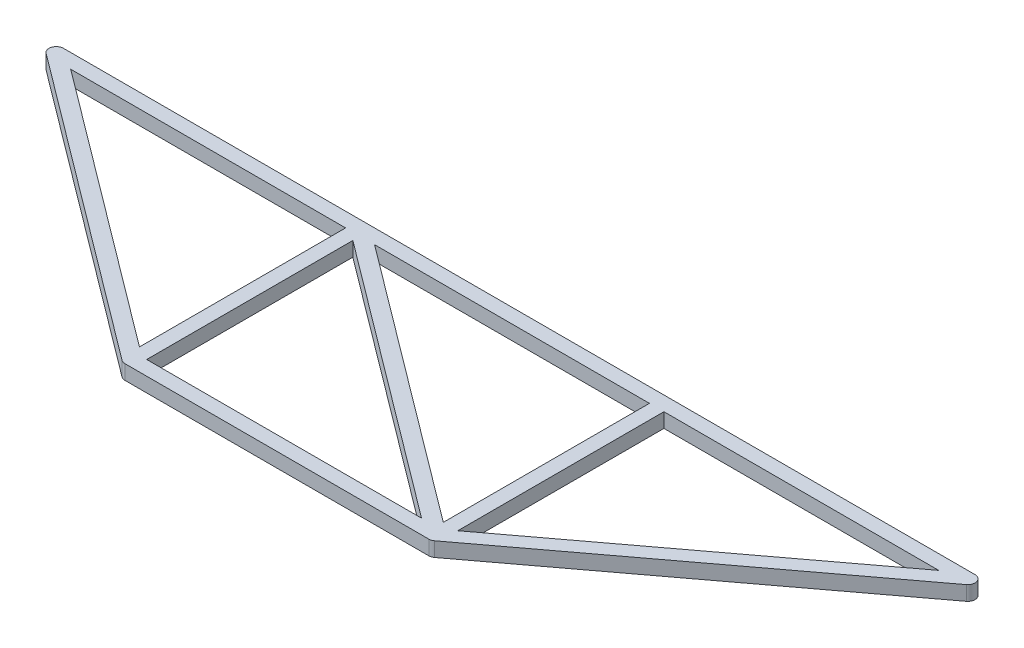
ISO-10303-21;
HEADER;
FILE_DESCRIPTION(('STEP AP214'),'2;1');
FILE_NAME('part.step','',(''),(''),'','','');
FILE_SCHEMA(('AUTOMOTIVE_DESIGN { 1 0 10303 214 1 1 1 1 }'));
ENDSEC;
DATA;
#1=APPLICATION_CONTEXT('core data for automotive mechanical design processes');
#2=APPLICATION_PROTOCOL_DEFINITION('international standard','automotive_design',2000,#1);
#3=PRODUCT_CONTEXT('',#1,'mechanical');
#4=PRODUCT('Part','Part','',(#3));
#5=PRODUCT_RELATED_PRODUCT_CATEGORY('part','',(#4));
#6=PRODUCT_DEFINITION_FORMATION('','',#4);
#7=PRODUCT_DEFINITION_CONTEXT('part definition',#1,'design');
#8=PRODUCT_DEFINITION('design','',#6,#7);
#9=PRODUCT_DEFINITION_SHAPE('','',#8);
#10=(LENGTH_UNIT() NAMED_UNIT(*) SI_UNIT(.MILLI.,.METRE.));
#11=(NAMED_UNIT(*) PLANE_ANGLE_UNIT() SI_UNIT($,.RADIAN.));
#12=(NAMED_UNIT(*) SI_UNIT($,.STERADIAN.) SOLID_ANGLE_UNIT());
#13=UNCERTAINTY_MEASURE_WITH_UNIT(LENGTH_MEASURE(1.E-05),#10,'distance_accuracy_value','');
#14=(GEOMETRIC_REPRESENTATION_CONTEXT(3) GLOBAL_UNCERTAINTY_ASSIGNED_CONTEXT((#13)) GLOBAL_UNIT_ASSIGNED_CONTEXT((#10,
#11,#12)) REPRESENTATION_CONTEXT('',''));
#15=CARTESIAN_POINT('',(0.,0.,0.));
#16=DIRECTION('',(0.,0.,1.));
#17=DIRECTION('',(1.,0.,0.));
#18=AXIS2_PLACEMENT_3D('',#15,#16,#17);
#19=CARTESIAN_POINT('',(0.,19.08,0.));
#20=DIRECTION('',(0.,-1.,0.));
#21=DIRECTION('',(0.,0.,-1.));
#22=AXIS2_PLACEMENT_3D('',#19,#20,#21);
#23=PLANE('',#22);
#24=DIRECTION('',(0.,0.,-1.));
#25=VECTOR('',#24,1.);
#26=CARTESIAN_POINT('',(790.46,19.08,9.54));
#27=LINE('',#26,#25);
#28=CARTESIAN_POINT('',(790.46,19.08,280.92185104477));
#29=VERTEX_POINT('',#28);
#30=CARTESIAN_POINT('',(790.46,19.08,9.54));
#31=VERTEX_POINT('',#30);
#32=EDGE_CURVE('E207',#29,#31,#27,.T.);
#33=ORIENTED_EDGE('',*,*,#32,.F.);
#34=DIRECTION('',(0.8,0.,0.6));
#35=VECTOR('',#34,1.);
#36=CARTESIAN_POINT('',(790.46,19.08,280.92185104477));
#37=LINE('',#36,#35);
#38=CARTESIAN_POINT('',(428.617531940306,19.08,9.53999999999999));
#39=VERTEX_POINT('',#38);
#40=EDGE_CURVE('E213',#39,#29,#37,.T.);
#41=ORIENTED_EDGE('',*,*,#40,.F.);
#42=DIRECTION('',(-1.,0.,0.));
#43=VECTOR('',#42,1.);
#44=CARTESIAN_POINT('',(428.617531940306,19.08,9.54));
#45=LINE('',#44,#43);
#46=EDGE_CURVE('E209',#31,#39,#45,.T.);
#47=ORIENTED_EDGE('',*,*,#46,.F.);
#48=EDGE_LOOP('',(#33,#41,#47));
#49=FACE_BOUND('',#48,.T.);
#50=DIRECTION('',(0.8,0.,0.6));
#51=VECTOR('',#50,1.);
#52=CARTESIAN_POINT('',(28.62,19.08,9.54));
#53=LINE('',#52,#51);
#54=CARTESIAN_POINT('',(28.62,19.08,9.54));
#55=VERTEX_POINT('',#54);
#56=CARTESIAN_POINT('',(390.46,19.08,280.92));
#57=VERTEX_POINT('',#56);
#58=EDGE_CURVE('E255',#55,#57,#53,.T.);
#59=ORIENTED_EDGE('',*,*,#58,.F.);
#60=DIRECTION('',(-1.,0.,0.));
#61=VECTOR('',#60,1.);
#62=CARTESIAN_POINT('',(390.46,19.08,9.54));
#63=LINE('',#62,#61);
#64=CARTESIAN_POINT('',(390.46,19.08,9.54));
#65=VERTEX_POINT('',#64);
#66=EDGE_CURVE('E261',#65,#55,#63,.T.);
#67=ORIENTED_EDGE('',*,*,#66,.F.);
#68=DIRECTION('',(0.,0.,-1.));
#69=VECTOR('',#68,1.);
#70=CARTESIAN_POINT('',(390.46,19.08,280.92));
#71=LINE('',#70,#69);
#72=EDGE_CURVE('E257',#57,#65,#71,.T.);
#73=ORIENTED_EDGE('',*,*,#72,.F.);
#74=EDGE_LOOP('',(#59,#67,#73));
#75=FACE_BOUND('',#74,.T.);
#76=CARTESIAN_POINT('',(0.,19.08,0.));
#77=DIRECTION('',(0.,1.,0.));
#78=DIRECTION('',(0.,0.,-1.));
#79=AXIS2_PLACEMENT_3D('',#76,#77,#78);
#80=CIRCLE('',#79,9.54000000000006);
#81=CARTESIAN_POINT('',(0.,19.08,-9.54));
#82=VERTEX_POINT('',#81);
#83=CARTESIAN_POINT('',(-5.72400000000007,19.08,7.6320000000001));
#84=VERTEX_POINT('',#83);
#85=EDGE_CURVE('E279',#82,#84,#80,.T.);
#86=ORIENTED_EDGE('',*,*,#85,.T.);
#87=DIRECTION('',(0.8,0.,0.6));
#88=VECTOR('',#87,1.);
#89=CARTESIAN_POINT('',(394.276,19.08,307.632));
#90=LINE('',#89,#88);
#91=CARTESIAN_POINT('',(394.276,19.08,307.632));
#92=VERTEX_POINT('',#91);
#93=EDGE_CURVE('E282',#84,#92,#90,.T.);
#94=ORIENTED_EDGE('',*,*,#93,.T.);
#95=CARTESIAN_POINT('',(400.,19.08,299.999999999999));
#96=DIRECTION('',(0.,1.,0.));
#97=DIRECTION('',(0.,0.,1.));
#98=AXIS2_PLACEMENT_3D('',#95,#96,#97);
#99=CIRCLE('',#98,9.54000000000055);
#100=CARTESIAN_POINT('',(400.,19.08,309.54));
#101=VERTEX_POINT('',#100);
#102=EDGE_CURVE('E285',#92,#101,#99,.T.);
#103=ORIENTED_EDGE('',*,*,#102,.T.);
#104=DIRECTION('',(1.,0.,0.));
#105=VECTOR('',#104,1.);
#106=CARTESIAN_POINT('',(800.,19.08,309.54));
#107=LINE('',#106,#105);
#108=CARTESIAN_POINT('',(800.,19.08,309.54));
#109=VERTEX_POINT('',#108);
#110=EDGE_CURVE('E287',#101,#109,#107,.T.);
#111=ORIENTED_EDGE('',*,*,#110,.T.);
#112=CARTESIAN_POINT('',(800.000000000001,19.08,300.000000000001));
#113=DIRECTION('',(0.,1.,0.));
#114=DIRECTION('',(0.,0.,1.));
#115=AXIS2_PLACEMENT_3D('',#112,#113,#114);
#116=CIRCLE('',#115,9.53999999999905);
#117=CARTESIAN_POINT('',(805.724,19.08,307.632));
#118=VERTEX_POINT('',#117);
#119=EDGE_CURVE('E289',#109,#118,#116,.T.);
#120=ORIENTED_EDGE('',*,*,#119,.T.);
#121=DIRECTION('',(0.8,0.,-0.6));
#122=VECTOR('',#121,1.);
#123=CARTESIAN_POINT('',(1205.724,19.08,7.632));
#124=LINE('',#123,#122);
#125=CARTESIAN_POINT('',(1205.724,19.08,7.63199999999998));
#126=VERTEX_POINT('',#125);
#127=EDGE_CURVE('E291',#118,#126,#124,.T.);
#128=ORIENTED_EDGE('',*,*,#127,.T.);
#129=CARTESIAN_POINT('',(1200.,19.08,0.));
#130=DIRECTION('',(0.,1.,0.));
#131=DIRECTION('',(0.,0.,1.));
#132=AXIS2_PLACEMENT_3D('',#129,#130,#131);
#133=CIRCLE('',#132,9.54000000000002);
#134=CARTESIAN_POINT('',(1200.,19.08,-9.54));
#135=VERTEX_POINT('',#134);
#136=EDGE_CURVE('E293',#126,#135,#133,.T.);
#137=ORIENTED_EDGE('',*,*,#136,.T.);
#138=DIRECTION('',(-1.,0.,0.));
#139=VECTOR('',#138,1.);
#140=CARTESIAN_POINT('',(0.,19.08,-9.54));
#141=LINE('',#140,#139);
#142=EDGE_CURVE('E295',#135,#82,#141,.T.);
#143=ORIENTED_EDGE('',*,*,#142,.T.);
#144=EDGE_LOOP('',(#86,#94,#103,#111,#120,#128,#137,#143));
#145=FACE_BOUND('',#144,.T.);
#146=DIRECTION('',(-0.8,0.,-0.6));
#147=VECTOR('',#146,1.);
#148=CARTESIAN_POINT('',(771.38,19.08,290.46));
#149=LINE('',#148,#147);
#150=CARTESIAN_POINT('',(771.38,19.08,290.46));
#151=VERTEX_POINT('',#150);
#152=CARTESIAN_POINT('',(409.54,19.08,19.0800000000001));
#153=VERTEX_POINT('',#152);
#154=EDGE_CURVE('E231',#151,#153,#149,.T.);
#155=ORIENTED_EDGE('',*,*,#154,.F.);
#156=DIRECTION('',(1.,0.,0.));
#157=VECTOR('',#156,1.);
#158=CARTESIAN_POINT('',(409.54,19.08,290.46));
#159=LINE('',#158,#157);
#160=CARTESIAN_POINT('',(409.54,19.08,290.46));
#161=VERTEX_POINT('',#160);
#162=EDGE_CURVE('E237',#161,#151,#159,.T.);
#163=ORIENTED_EDGE('',*,*,#162,.F.);
#164=DIRECTION('',(0.,0.,1.));
#165=VECTOR('',#164,1.);
#166=CARTESIAN_POINT('',(409.54,19.08,19.0800000000001));
#167=LINE('',#166,#165);
#168=EDGE_CURVE('E233',#153,#161,#167,.T.);
#169=ORIENTED_EDGE('',*,*,#168,.F.);
#170=EDGE_LOOP('',(#155,#163,#169));
#171=FACE_BOUND('',#170,.T.);
#172=DIRECTION('',(0.,0.,1.));
#173=VECTOR('',#172,1.);
#174=CARTESIAN_POINT('',(809.54,19.08,9.54));
#175=LINE('',#174,#173);
#176=CARTESIAN_POINT('',(809.54,19.08,9.54));
#177=VERTEX_POINT('',#176);
#178=CARTESIAN_POINT('',(809.54,19.08,280.92));
#179=VERTEX_POINT('',#178);
#180=EDGE_CURVE('E180',#177,#179,#175,.T.);
#181=ORIENTED_EDGE('',*,*,#180,.F.);
#182=DIRECTION('',(-1.,0.,0.));
#183=VECTOR('',#182,1.);
#184=CARTESIAN_POINT('',(1171.38,19.08,9.54));
#185=LINE('',#184,#183);
#186=CARTESIAN_POINT('',(1171.38,19.08,9.54));
#187=VERTEX_POINT('',#186);
#188=EDGE_CURVE('E197',#187,#177,#185,.T.);
#189=ORIENTED_EDGE('',*,*,#188,.F.);
#190=DIRECTION('',(0.8,0.,-0.6));
#191=VECTOR('',#190,1.);
#192=CARTESIAN_POINT('',(809.54,19.08,280.92));
#193=LINE('',#192,#191);
#194=EDGE_CURVE('E188',#179,#187,#193,.T.);
#195=ORIENTED_EDGE('',*,*,#194,.F.);
#196=EDGE_LOOP('',(#181,#189,#195));
#197=FACE_BOUND('',#196,.T.);
#198=ADVANCED_FACE('F43',(#49,#75,#145,#171,#197),#23,.F.);
#199=CARTESIAN_POINT('',(0.,0.,0.));
#200=DIRECTION('',(0.,-1.,0.));
#201=DIRECTION('',(0.,0.,-1.));
#202=AXIS2_PLACEMENT_3D('',#199,#200,#201);
#203=PLANE('',#202);
#204=CARTESIAN_POINT('',(0.,0.,0.));
#205=DIRECTION('',(0.,1.,0.));
#206=DIRECTION('',(0.,0.,-1.));
#207=AXIS2_PLACEMENT_3D('',#204,#205,#206);
#208=CIRCLE('',#207,9.54000000000006);
#209=CARTESIAN_POINT('',(0.,0.,-9.54));
#210=VERTEX_POINT('',#209);
#211=CARTESIAN_POINT('',(-5.72400000000007,0.,7.6320000000001));
#212=VERTEX_POINT('',#211);
#213=EDGE_CURVE('E278',#210,#212,#208,.T.);
#214=ORIENTED_EDGE('',*,*,#213,.F.);
#215=DIRECTION('',(-1.,0.,0.));
#216=VECTOR('',#215,1.);
#217=CARTESIAN_POINT('',(0.,0.,-9.54));
#218=LINE('',#217,#216);
#219=CARTESIAN_POINT('',(1200.,0.,-9.54));
#220=VERTEX_POINT('',#219);
#221=EDGE_CURVE('E283',#220,#210,#218,.T.);
#222=ORIENTED_EDGE('',*,*,#221,.F.);
#223=CARTESIAN_POINT('',(1200.,0.,0.));
#224=DIRECTION('',(0.,1.,0.));
#225=DIRECTION('',(0.,0.,1.));
#226=AXIS2_PLACEMENT_3D('',#223,#224,#225);
#227=CIRCLE('',#226,9.54000000000002);
#228=CARTESIAN_POINT('',(1205.724,0.,7.63199999999998));
#229=VERTEX_POINT('',#228);
#230=EDGE_CURVE('E310',#229,#220,#227,.T.);
#231=ORIENTED_EDGE('',*,*,#230,.F.);
#232=DIRECTION('',(0.8,0.,-0.6));
#233=VECTOR('',#232,1.);
#234=CARTESIAN_POINT('',(1205.724,0.,7.632));
#235=LINE('',#234,#233);
#236=CARTESIAN_POINT('',(805.724,0.,307.632));
#237=VERTEX_POINT('',#236);
#238=EDGE_CURVE('E308',#237,#229,#235,.T.);
#239=ORIENTED_EDGE('',*,*,#238,.F.);
#240=CARTESIAN_POINT('',(800.000000000001,0.,300.000000000001));
#241=DIRECTION('',(0.,1.,0.));
#242=DIRECTION('',(0.,0.,1.));
#243=AXIS2_PLACEMENT_3D('',#240,#241,#242);
#244=CIRCLE('',#243,9.53999999999905);
#245=CARTESIAN_POINT('',(800.,0.,309.54));
#246=VERTEX_POINT('',#245);
#247=EDGE_CURVE('E306',#246,#237,#244,.T.);
#248=ORIENTED_EDGE('',*,*,#247,.F.);
#249=DIRECTION('',(1.,0.,0.));
#250=VECTOR('',#249,1.);
#251=CARTESIAN_POINT('',(800.,0.,309.54));
#252=LINE('',#251,#250);
#253=CARTESIAN_POINT('',(400.,0.,309.54));
#254=VERTEX_POINT('',#253);
#255=EDGE_CURVE('E304',#254,#246,#252,.T.);
#256=ORIENTED_EDGE('',*,*,#255,.F.);
#257=CARTESIAN_POINT('',(400.,0.,299.999999999999));
#258=DIRECTION('',(0.,1.,0.));
#259=DIRECTION('',(0.,0.,1.));
#260=AXIS2_PLACEMENT_3D('',#257,#258,#259);
#261=CIRCLE('',#260,9.54000000000055);
#262=CARTESIAN_POINT('',(394.276,0.,307.632));
#263=VERTEX_POINT('',#262);
#264=EDGE_CURVE('E302',#263,#254,#261,.T.);
#265=ORIENTED_EDGE('',*,*,#264,.F.);
#266=DIRECTION('',(0.8,0.,0.6));
#267=VECTOR('',#266,1.);
#268=CARTESIAN_POINT('',(394.276,0.,307.632));
#269=LINE('',#268,#267);
#270=EDGE_CURVE('E300',#212,#263,#269,.T.);
#271=ORIENTED_EDGE('',*,*,#270,.F.);
#272=EDGE_LOOP('',(#214,#222,#231,#239,#248,#256,#265,#271));
#273=FACE_BOUND('',#272,.T.);
#274=DIRECTION('',(-1.,0.,0.));
#275=VECTOR('',#274,1.);
#276=CARTESIAN_POINT('',(390.46,0.,9.54));
#277=LINE('',#276,#275);
#278=CARTESIAN_POINT('',(390.46,0.,9.54));
#279=VERTEX_POINT('',#278);
#280=CARTESIAN_POINT('',(28.62,0.,9.54));
#281=VERTEX_POINT('',#280);
#282=EDGE_CURVE('E258',#279,#281,#277,.T.);
#283=ORIENTED_EDGE('',*,*,#282,.T.);
#284=DIRECTION('',(0.8,0.,0.6));
#285=VECTOR('',#284,1.);
#286=CARTESIAN_POINT('',(28.62,0.,9.54));
#287=LINE('',#286,#285);
#288=CARTESIAN_POINT('',(390.46,0.,280.92));
#289=VERTEX_POINT('',#288);
#290=EDGE_CURVE('E254',#281,#289,#287,.T.);
#291=ORIENTED_EDGE('',*,*,#290,.T.);
#292=DIRECTION('',(0.,0.,-1.));
#293=VECTOR('',#292,1.);
#294=CARTESIAN_POINT('',(390.46,0.,280.92));
#295=LINE('',#294,#293);
#296=EDGE_CURVE('E266',#289,#279,#295,.T.);
#297=ORIENTED_EDGE('',*,*,#296,.T.);
#298=EDGE_LOOP('',(#283,#291,#297));
#299=FACE_BOUND('',#298,.T.);
#300=DIRECTION('',(1.,0.,0.));
#301=VECTOR('',#300,1.);
#302=CARTESIAN_POINT('',(409.54,0.,290.46));
#303=LINE('',#302,#301);
#304=CARTESIAN_POINT('',(409.54,0.,290.46));
#305=VERTEX_POINT('',#304);
#306=CARTESIAN_POINT('',(771.38,0.,290.46));
#307=VERTEX_POINT('',#306);
#308=EDGE_CURVE('E234',#305,#307,#303,.T.);
#309=ORIENTED_EDGE('',*,*,#308,.T.);
#310=DIRECTION('',(-0.8,0.,-0.6));
#311=VECTOR('',#310,1.);
#312=CARTESIAN_POINT('',(771.38,0.,290.46));
#313=LINE('',#312,#311);
#314=CARTESIAN_POINT('',(409.54,0.,19.0800000000001));
#315=VERTEX_POINT('',#314);
#316=EDGE_CURVE('E230',#307,#315,#313,.T.);
#317=ORIENTED_EDGE('',*,*,#316,.T.);
#318=DIRECTION('',(0.,0.,1.));
#319=VECTOR('',#318,1.);
#320=CARTESIAN_POINT('',(409.54,0.,19.0800000000001));
#321=LINE('',#320,#319);
#322=EDGE_CURVE('E242',#315,#305,#321,.T.);
#323=ORIENTED_EDGE('',*,*,#322,.T.);
#324=EDGE_LOOP('',(#309,#317,#323));
#325=FACE_BOUND('',#324,.T.);
#326=DIRECTION('',(0.8,0.,0.6));
#327=VECTOR('',#326,1.);
#328=CARTESIAN_POINT('',(790.46,0.,280.92185104477));
#329=LINE('',#328,#327);
#330=CARTESIAN_POINT('',(428.617531940306,0.,9.54));
#331=VERTEX_POINT('',#330);
#332=CARTESIAN_POINT('',(790.46,0.,280.92185104477));
#333=VERTEX_POINT('',#332);
#334=EDGE_CURVE('E210',#331,#333,#329,.T.);
#335=ORIENTED_EDGE('',*,*,#334,.T.);
#336=DIRECTION('',(0.,0.,-1.));
#337=VECTOR('',#336,1.);
#338=CARTESIAN_POINT('',(790.46,0.,9.54));
#339=LINE('',#338,#337);
#340=CARTESIAN_POINT('',(790.46,0.,9.54));
#341=VERTEX_POINT('',#340);
#342=EDGE_CURVE('E195',#333,#341,#339,.T.);
#343=ORIENTED_EDGE('',*,*,#342,.T.);
#344=DIRECTION('',(-1.,0.,0.));
#345=VECTOR('',#344,1.);
#346=CARTESIAN_POINT('',(428.617531940306,0.,9.54));
#347=LINE('',#346,#345);
#348=EDGE_CURVE('E218',#341,#331,#347,.T.);
#349=ORIENTED_EDGE('',*,*,#348,.T.);
#350=EDGE_LOOP('',(#335,#343,#349));
#351=FACE_BOUND('',#350,.T.);
#352=DIRECTION('',(-1.,0.,0.));
#353=VECTOR('',#352,1.);
#354=CARTESIAN_POINT('',(1171.38,0.,9.54));
#355=LINE('',#354,#353);
#356=CARTESIAN_POINT('',(1171.38,0.,9.54));
#357=VERTEX_POINT('',#356);
#358=CARTESIAN_POINT('',(809.54,0.,9.54));
#359=VERTEX_POINT('',#358);
#360=EDGE_CURVE('E189',#357,#359,#355,.T.);
#361=ORIENTED_EDGE('',*,*,#360,.T.);
#362=DIRECTION('',(0.,0.,1.));
#363=VECTOR('',#362,1.);
#364=CARTESIAN_POINT('',(809.54,0.,9.54));
#365=LINE('',#364,#363);
#366=CARTESIAN_POINT('',(809.54,0.,280.92));
#367=VERTEX_POINT('',#366);
#368=EDGE_CURVE('E66',#359,#367,#365,.T.);
#369=ORIENTED_EDGE('',*,*,#368,.T.);
#370=DIRECTION('',(0.8,0.,-0.6));
#371=VECTOR('',#370,1.);
#372=CARTESIAN_POINT('',(809.54,0.,280.92));
#373=LINE('',#372,#371);
#374=EDGE_CURVE('E194',#367,#357,#373,.T.);
#375=ORIENTED_EDGE('',*,*,#374,.T.);
#376=EDGE_LOOP('',(#361,#369,#375));
#377=FACE_BOUND('',#376,.T.);
#378=ADVANCED_FACE('F340',(#273,#299,#325,#351,#377),#203,.T.);
#379=CARTESIAN_POINT('',(0.,19.08,0.));
#380=DIRECTION('',(0.,-1.,0.));
#381=DIRECTION('',(0.,0.,-1.));
#382=AXIS2_PLACEMENT_3D('',#379,#380,#381);
#383=CYLINDRICAL_SURFACE('',#382,9.54000000000006);
#384=ORIENTED_EDGE('',*,*,#213,.T.);
#385=DIRECTION('',(0.,-1.,0.));
#386=VECTOR('',#385,1.);
#387=CARTESIAN_POINT('',(-5.72400000000007,19.08,7.6320000000001));
#388=LINE('',#387,#386);
#389=EDGE_CURVE('E11',#84,#212,#388,.T.);
#390=ORIENTED_EDGE('',*,*,#389,.F.);
#391=ORIENTED_EDGE('',*,*,#85,.F.);
#392=DIRECTION('',(0.,-1.,0.));
#393=VECTOR('',#392,1.);
#394=CARTESIAN_POINT('',(0.,19.08,-9.54));
#395=LINE('',#394,#393);
#396=EDGE_CURVE('E297',#82,#210,#395,.T.);
#397=ORIENTED_EDGE('',*,*,#396,.T.);
#398=EDGE_LOOP('',(#384,#390,#391,#397));
#399=FACE_BOUND('',#398,.T.);
#400=ADVANCED_FACE('F45',(#399),#383,.T.);
#401=CARTESIAN_POINT('',(394.276,19.08,307.632));
#402=DIRECTION('',(0.6,0.,-0.8));
#403=DIRECTION('',(-0.8,0.,-0.6));
#404=AXIS2_PLACEMENT_3D('',#401,#402,#403);
#405=PLANE('',#404);
#406=ORIENTED_EDGE('',*,*,#270,.T.);
#407=DIRECTION('',(0.,-1.,0.));
#408=VECTOR('',#407,1.);
#409=CARTESIAN_POINT('',(394.276,19.08,307.632));
#410=LINE('',#409,#408);
#411=EDGE_CURVE('E51',#92,#263,#410,.T.);
#412=ORIENTED_EDGE('',*,*,#411,.F.);
#413=ORIENTED_EDGE('',*,*,#93,.F.);
#414=ORIENTED_EDGE('',*,*,#389,.T.);
#415=EDGE_LOOP('',(#406,#412,#413,#414));
#416=FACE_BOUND('',#415,.T.);
#417=ADVANCED_FACE('F358',(#416),#405,.F.);
#418=CARTESIAN_POINT('',(400.,19.08,299.999999999999));
#419=DIRECTION('',(0.,-1.,0.));
#420=DIRECTION('',(0.,0.,-1.));
#421=AXIS2_PLACEMENT_3D('',#418,#419,#420);
#422=CYLINDRICAL_SURFACE('',#421,9.54000000000055);
#423=ORIENTED_EDGE('',*,*,#264,.T.);
#424=DIRECTION('',(0.,-1.,0.));
#425=VECTOR('',#424,1.);
#426=CARTESIAN_POINT('',(400.,19.08,309.54));
#427=LINE('',#426,#425);
#428=EDGE_CURVE('E327',#101,#254,#427,.T.);
#429=ORIENTED_EDGE('',*,*,#428,.F.);
#430=ORIENTED_EDGE('',*,*,#102,.F.);
#431=ORIENTED_EDGE('',*,*,#411,.T.);
#432=EDGE_LOOP('',(#423,#429,#430,#431));
#433=FACE_BOUND('',#432,.T.);
#434=ADVANCED_FACE('F334',(#433),#422,.T.);
#435=CARTESIAN_POINT('',(800.,19.08,309.54));
#436=DIRECTION('',(0.,0.,-1.));
#437=DIRECTION('',(-1.,0.,0.));
#438=AXIS2_PLACEMENT_3D('',#435,#436,#437);
#439=PLANE('',#438);
#440=ORIENTED_EDGE('',*,*,#255,.T.);
#441=DIRECTION('',(0.,-1.,0.));
#442=VECTOR('',#441,1.);
#443=CARTESIAN_POINT('',(800.,19.08,309.54));
#444=LINE('',#443,#442);
#445=EDGE_CURVE('E324',#109,#246,#444,.T.);
#446=ORIENTED_EDGE('',*,*,#445,.F.);
#447=ORIENTED_EDGE('',*,*,#110,.F.);
#448=ORIENTED_EDGE('',*,*,#428,.T.);
#449=EDGE_LOOP('',(#440,#446,#447,#448));
#450=FACE_BOUND('',#449,.T.);
#451=ADVANCED_FACE('F346',(#450),#439,.F.);
#452=CARTESIAN_POINT('',(800.000000000001,19.08,300.000000000001));
#453=DIRECTION('',(0.,-1.,0.));
#454=DIRECTION('',(0.,0.,-1.));
#455=AXIS2_PLACEMENT_3D('',#452,#453,#454);
#456=CYLINDRICAL_SURFACE('',#455,9.53999999999905);
#457=ORIENTED_EDGE('',*,*,#247,.T.);
#458=DIRECTION('',(0.,-1.,0.));
#459=VECTOR('',#458,1.);
#460=CARTESIAN_POINT('',(805.724,19.08,307.632));
#461=LINE('',#460,#459);
#462=EDGE_CURVE('E321',#118,#237,#461,.T.);
#463=ORIENTED_EDGE('',*,*,#462,.F.);
#464=ORIENTED_EDGE('',*,*,#119,.F.);
#465=ORIENTED_EDGE('',*,*,#445,.T.);
#466=EDGE_LOOP('',(#457,#463,#464,#465));
#467=FACE_BOUND('',#466,.T.);
#468=ADVANCED_FACE('F350',(#467),#456,.T.);
#469=CARTESIAN_POINT('',(1205.724,19.08,7.632));
#470=DIRECTION('',(-0.6,0.,-0.8));
#471=DIRECTION('',(-0.8,0.,0.6));
#472=AXIS2_PLACEMENT_3D('',#469,#470,#471);
#473=PLANE('',#472);
#474=ORIENTED_EDGE('',*,*,#238,.T.);
#475=DIRECTION('',(0.,-1.,0.));
#476=VECTOR('',#475,1.);
#477=CARTESIAN_POINT('',(1205.724,19.08,7.63199999999998));
#478=LINE('',#477,#476);
#479=EDGE_CURVE('E318',#126,#229,#478,.T.);
#480=ORIENTED_EDGE('',*,*,#479,.F.);
#481=ORIENTED_EDGE('',*,*,#127,.F.);
#482=ORIENTED_EDGE('',*,*,#462,.T.);
#483=EDGE_LOOP('',(#474,#480,#481,#482));
#484=FACE_BOUND('',#483,.T.);
#485=ADVANCED_FACE('F371',(#484),#473,.F.);
#486=CARTESIAN_POINT('',(1200.,19.08,0.));
#487=DIRECTION('',(0.,-1.,0.));
#488=DIRECTION('',(0.,0.,-1.));
#489=AXIS2_PLACEMENT_3D('',#486,#487,#488);
#490=CYLINDRICAL_SURFACE('',#489,9.54000000000002);
#491=ORIENTED_EDGE('',*,*,#230,.T.);
#492=DIRECTION('',(0.,-1.,0.));
#493=VECTOR('',#492,1.);
#494=CARTESIAN_POINT('',(1200.,19.08,-9.54));
#495=LINE('',#494,#493);
#496=EDGE_CURVE('E315',#135,#220,#495,.T.);
#497=ORIENTED_EDGE('',*,*,#496,.F.);
#498=ORIENTED_EDGE('',*,*,#136,.F.);
#499=ORIENTED_EDGE('',*,*,#479,.T.);
#500=EDGE_LOOP('',(#491,#497,#498,#499));
#501=FACE_BOUND('',#500,.T.);
#502=ADVANCED_FACE('F369',(#501),#490,.T.);
#503=CARTESIAN_POINT('',(0.,19.08,-9.54));
#504=DIRECTION('',(0.,0.,1.));
#505=DIRECTION('',(1.,0.,0.));
#506=AXIS2_PLACEMENT_3D('',#503,#504,#505);
#507=PLANE('',#506);
#508=ORIENTED_EDGE('',*,*,#221,.T.);
#509=ORIENTED_EDGE('',*,*,#396,.F.);
#510=ORIENTED_EDGE('',*,*,#142,.F.);
#511=ORIENTED_EDGE('',*,*,#496,.T.);
#512=EDGE_LOOP('',(#508,#509,#510,#511));
#513=FACE_BOUND('',#512,.T.);
#514=ADVANCED_FACE('F364',(#513),#507,.F.);
#515=CARTESIAN_POINT('',(28.62,19.08,9.54));
#516=DIRECTION('',(0.6,0.,-0.8));
#517=DIRECTION('',(-0.8,0.,-0.6));
#518=AXIS2_PLACEMENT_3D('',#515,#516,#517);
#519=PLANE('',#518);
#520=ORIENTED_EDGE('',*,*,#290,.F.);
#521=DIRECTION('',(0.,-1.,0.));
#522=VECTOR('',#521,1.);
#523=CARTESIAN_POINT('',(28.62,19.08,9.54));
#524=LINE('',#523,#522);
#525=EDGE_CURVE('E263',#55,#281,#524,.T.);
#526=ORIENTED_EDGE('',*,*,#525,.F.);
#527=ORIENTED_EDGE('',*,*,#58,.T.);
#528=DIRECTION('',(0.,-1.,0.));
#529=VECTOR('',#528,1.);
#530=CARTESIAN_POINT('',(390.46,19.08,280.92));
#531=LINE('',#530,#529);
#532=EDGE_CURVE('E275',#57,#289,#531,.T.);
#533=ORIENTED_EDGE('',*,*,#532,.T.);
#534=EDGE_LOOP('',(#520,#526,#527,#533));
#535=FACE_BOUND('',#534,.T.);
#536=ADVANCED_FACE('F390',(#535),#519,.T.);
#537=CARTESIAN_POINT('',(390.46,19.08,280.92));
#538=DIRECTION('',(-1.,0.,0.));
#539=DIRECTION('',(0.,0.,1.));
#540=AXIS2_PLACEMENT_3D('',#537,#538,#539);
#541=PLANE('',#540);
#542=ORIENTED_EDGE('',*,*,#296,.F.);
#543=ORIENTED_EDGE('',*,*,#532,.F.);
#544=ORIENTED_EDGE('',*,*,#72,.T.);
#545=DIRECTION('',(0.,-1.,0.));
#546=VECTOR('',#545,1.);
#547=CARTESIAN_POINT('',(390.46,19.08,9.54));
#548=LINE('',#547,#546);
#549=EDGE_CURVE('E273',#65,#279,#548,.T.);
#550=ORIENTED_EDGE('',*,*,#549,.T.);
#551=EDGE_LOOP('',(#542,#543,#544,#550));
#552=FACE_BOUND('',#551,.T.);
#553=ADVANCED_FACE('F397',(#552),#541,.T.);
#554=CARTESIAN_POINT('',(390.46,19.08,9.54));
#555=DIRECTION('',(0.,0.,1.));
#556=DIRECTION('',(1.,0.,0.));
#557=AXIS2_PLACEMENT_3D('',#554,#555,#556);
#558=PLANE('',#557);
#559=ORIENTED_EDGE('',*,*,#282,.F.);
#560=ORIENTED_EDGE('',*,*,#549,.F.);
#561=ORIENTED_EDGE('',*,*,#66,.T.);
#562=ORIENTED_EDGE('',*,*,#525,.T.);
#563=EDGE_LOOP('',(#559,#560,#561,#562));
#564=FACE_BOUND('',#563,.T.);
#565=ADVANCED_FACE('F402',(#564),#558,.T.);
#566=CARTESIAN_POINT('',(771.38,19.08,290.46));
#567=DIRECTION('',(-0.6,0.,0.8));
#568=DIRECTION('',(0.8,0.,0.6));
#569=AXIS2_PLACEMENT_3D('',#566,#567,#568);
#570=PLANE('',#569);
#571=ORIENTED_EDGE('',*,*,#316,.F.);
#572=DIRECTION('',(0.,-1.,0.));
#573=VECTOR('',#572,1.);
#574=CARTESIAN_POINT('',(771.38,19.08,290.46));
#575=LINE('',#574,#573);
#576=EDGE_CURVE('E239',#151,#307,#575,.T.);
#577=ORIENTED_EDGE('',*,*,#576,.F.);
#578=ORIENTED_EDGE('',*,*,#154,.T.);
#579=DIRECTION('',(0.,-1.,0.));
#580=VECTOR('',#579,1.);
#581=CARTESIAN_POINT('',(409.54,19.08,19.0800000000001));
#582=LINE('',#581,#580);
#583=EDGE_CURVE('E251',#153,#315,#582,.T.);
#584=ORIENTED_EDGE('',*,*,#583,.T.);
#585=EDGE_LOOP('',(#571,#577,#578,#584));
#586=FACE_BOUND('',#585,.T.);
#587=ADVANCED_FACE('F445',(#586),#570,.T.);
#588=CARTESIAN_POINT('',(409.54,19.08,19.0800000000001));
#589=DIRECTION('',(1.,0.,0.));
#590=DIRECTION('',(0.,0.,-1.));
#591=AXIS2_PLACEMENT_3D('',#588,#589,#590);
#592=PLANE('',#591);
#593=ORIENTED_EDGE('',*,*,#322,.F.);
#594=ORIENTED_EDGE('',*,*,#583,.F.);
#595=ORIENTED_EDGE('',*,*,#168,.T.);
#596=DIRECTION('',(0.,-1.,0.));
#597=VECTOR('',#596,1.);
#598=CARTESIAN_POINT('',(409.54,19.08,290.46));
#599=LINE('',#598,#597);
#600=EDGE_CURVE('E249',#161,#305,#599,.T.);
#601=ORIENTED_EDGE('',*,*,#600,.T.);
#602=EDGE_LOOP('',(#593,#594,#595,#601));
#603=FACE_BOUND('',#602,.T.);
#604=ADVANCED_FACE('F441',(#603),#592,.T.);
#605=CARTESIAN_POINT('',(409.54,19.08,290.46));
#606=DIRECTION('',(0.,0.,-1.));
#607=DIRECTION('',(-1.,0.,0.));
#608=AXIS2_PLACEMENT_3D('',#605,#606,#607);
#609=PLANE('',#608);
#610=ORIENTED_EDGE('',*,*,#308,.F.);
#611=ORIENTED_EDGE('',*,*,#600,.F.);
#612=ORIENTED_EDGE('',*,*,#162,.T.);
#613=ORIENTED_EDGE('',*,*,#576,.T.);
#614=EDGE_LOOP('',(#610,#611,#612,#613));
#615=FACE_BOUND('',#614,.T.);
#616=ADVANCED_FACE('F437',(#615),#609,.T.);
#617=CARTESIAN_POINT('',(790.46,19.08,9.54));
#618=DIRECTION('',(-1.,0.,0.));
#619=DIRECTION('',(0.,0.,1.));
#620=AXIS2_PLACEMENT_3D('',#617,#618,#619);
#621=PLANE('',#620);
#622=ORIENTED_EDGE('',*,*,#342,.F.);
#623=DIRECTION('',(0.,-1.,0.));
#624=VECTOR('',#623,1.);
#625=CARTESIAN_POINT('',(790.46,19.08,280.92185104477));
#626=LINE('',#625,#624);
#627=EDGE_CURVE('E215',#29,#333,#626,.T.);
#628=ORIENTED_EDGE('',*,*,#627,.F.);
#629=ORIENTED_EDGE('',*,*,#32,.T.);
#630=DIRECTION('',(0.,-1.,0.));
#631=VECTOR('',#630,1.);
#632=CARTESIAN_POINT('',(790.46,19.08,9.54));
#633=LINE('',#632,#631);
#634=EDGE_CURVE('E227',#31,#341,#633,.T.);
#635=ORIENTED_EDGE('',*,*,#634,.T.);
#636=EDGE_LOOP('',(#622,#628,#629,#635));
#637=FACE_BOUND('',#636,.T.);
#638=ADVANCED_FACE('F433',(#637),#621,.T.);
#639=CARTESIAN_POINT('',(428.617531940306,19.08,9.54));
#640=DIRECTION('',(0.,0.,1.));
#641=DIRECTION('',(1.,0.,0.));
#642=AXIS2_PLACEMENT_3D('',#639,#640,#641);
#643=PLANE('',#642);
#644=ORIENTED_EDGE('',*,*,#348,.F.);
#645=ORIENTED_EDGE('',*,*,#634,.F.);
#646=ORIENTED_EDGE('',*,*,#46,.T.);
#647=DIRECTION('',(0.,-1.,0.));
#648=VECTOR('',#647,1.);
#649=CARTESIAN_POINT('',(428.617531940306,19.08,9.54));
#650=LINE('',#649,#648);
#651=EDGE_CURVE('E225',#39,#331,#650,.T.);
#652=ORIENTED_EDGE('',*,*,#651,.T.);
#653=EDGE_LOOP('',(#644,#645,#646,#652));
#654=FACE_BOUND('',#653,.T.);
#655=ADVANCED_FACE('F429',(#654),#643,.T.);
#656=CARTESIAN_POINT('',(790.46,19.08,280.92185104477));
#657=DIRECTION('',(0.6,0.,-0.8));
#658=DIRECTION('',(-0.8,0.,-0.6));
#659=AXIS2_PLACEMENT_3D('',#656,#657,#658);
#660=PLANE('',#659);
#661=ORIENTED_EDGE('',*,*,#334,.F.);
#662=ORIENTED_EDGE('',*,*,#651,.F.);
#663=ORIENTED_EDGE('',*,*,#40,.T.);
#664=ORIENTED_EDGE('',*,*,#627,.T.);
#665=EDGE_LOOP('',(#661,#662,#663,#664));
#666=FACE_BOUND('',#665,.T.);
#667=ADVANCED_FACE('F426',(#666),#660,.T.);
#668=CARTESIAN_POINT('',(809.54,19.08,9.54));
#669=DIRECTION('',(1.,0.,0.));
#670=DIRECTION('',(0.,0.,-1.));
#671=AXIS2_PLACEMENT_3D('',#668,#669,#670);
#672=PLANE('',#671);
#673=ORIENTED_EDGE('',*,*,#368,.F.);
#674=DIRECTION('',(0.,-1.,0.));
#675=VECTOR('',#674,1.);
#676=CARTESIAN_POINT('',(809.54,19.08,9.54));
#677=LINE('',#676,#675);
#678=EDGE_CURVE('E184',#177,#359,#677,.T.);
#679=ORIENTED_EDGE('',*,*,#678,.F.);
#680=ORIENTED_EDGE('',*,*,#180,.T.);
#681=DIRECTION('',(0.,-1.,0.));
#682=VECTOR('',#681,1.);
#683=CARTESIAN_POINT('',(809.54,19.08,280.92));
#684=LINE('',#683,#682);
#685=EDGE_CURVE('E183',#179,#367,#684,.T.);
#686=ORIENTED_EDGE('',*,*,#685,.T.);
#687=EDGE_LOOP('',(#673,#679,#680,#686));
#688=FACE_BOUND('',#687,.T.);
#689=ADVANCED_FACE('F182',(#688),#672,.T.);
#690=CARTESIAN_POINT('',(809.54,19.08,280.92));
#691=DIRECTION('',(-0.6,0.,-0.8));
#692=DIRECTION('',(-0.8,0.,0.6));
#693=AXIS2_PLACEMENT_3D('',#690,#691,#692);
#694=PLANE('',#693);
#695=ORIENTED_EDGE('',*,*,#374,.F.);
#696=ORIENTED_EDGE('',*,*,#685,.F.);
#697=ORIENTED_EDGE('',*,*,#194,.T.);
#698=DIRECTION('',(0.,-1.,0.));
#699=VECTOR('',#698,1.);
#700=CARTESIAN_POINT('',(1171.38,19.08,9.54));
#701=LINE('',#700,#699);
#702=EDGE_CURVE('E58',#187,#357,#701,.T.);
#703=ORIENTED_EDGE('',*,*,#702,.T.);
#704=EDGE_LOOP('',(#695,#696,#697,#703));
#705=FACE_BOUND('',#704,.T.);
#706=ADVANCED_FACE('F192',(#705),#694,.T.);
#707=CARTESIAN_POINT('',(1171.38,19.08,9.54));
#708=DIRECTION('',(0.,0.,1.));
#709=DIRECTION('',(1.,0.,0.));
#710=AXIS2_PLACEMENT_3D('',#707,#708,#709);
#711=PLANE('',#710);
#712=ORIENTED_EDGE('',*,*,#360,.F.);
#713=ORIENTED_EDGE('',*,*,#702,.F.);
#714=ORIENTED_EDGE('',*,*,#188,.T.);
#715=ORIENTED_EDGE('',*,*,#678,.T.);
#716=EDGE_LOOP('',(#712,#713,#714,#715));
#717=FACE_BOUND('',#716,.T.);
#718=ADVANCED_FACE('F416',(#717),#711,.T.);
#719=CLOSED_SHELL('',(#198,#378,#400,#417,#434,#451,#468,#485,#502,#514,#536,#553,#565,#587,
#604,#616,#638,#655,#667,#689,#706,#718));
#720=MANIFOLD_SOLID_BREP('B2',#719);
#721=ADVANCED_BREP_SHAPE_REPRESENTATION('',(#18,#720),#14);
#722=SHAPE_DEFINITION_REPRESENTATION(#9,#721);
ENDSEC;
END-ISO-10303-21;
